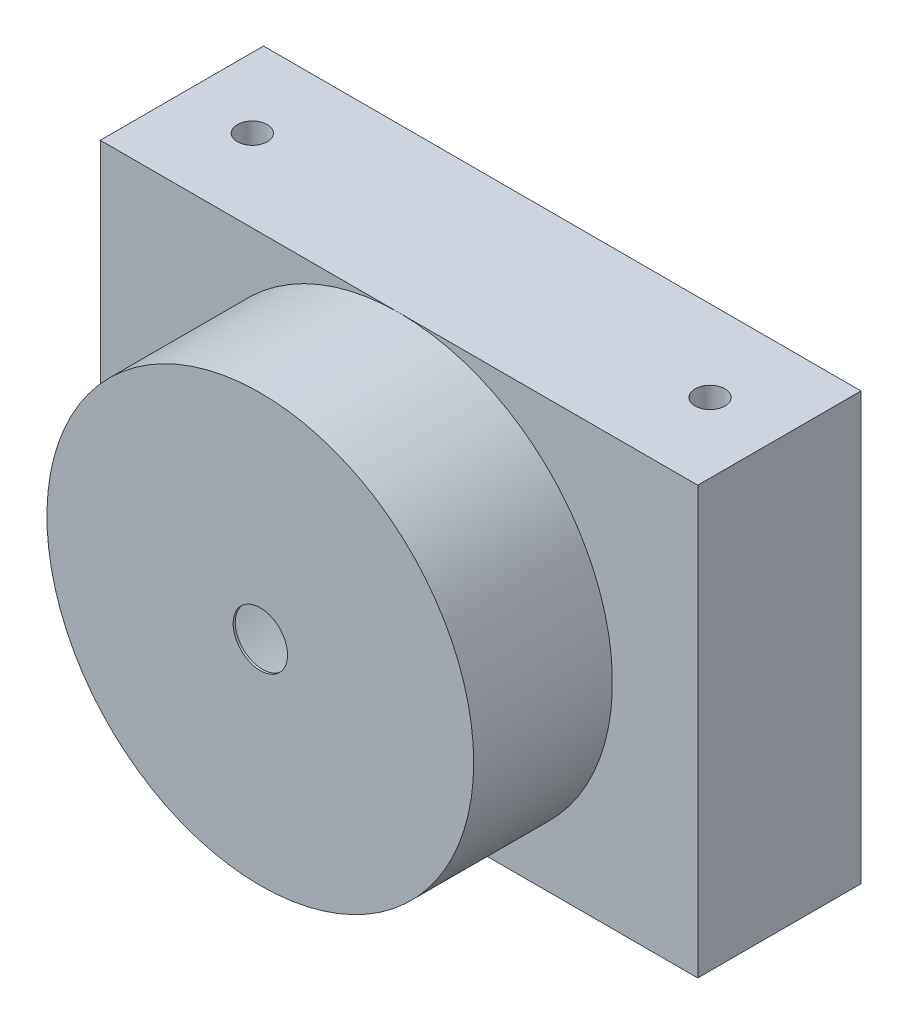
ISO-10303-21;
HEADER;
FILE_DESCRIPTION(('STEP AP214'),'2;1');
FILE_NAME('part.step','',(''),(''),'','','');
FILE_SCHEMA(('AUTOMOTIVE_DESIGN { 1 0 10303 214 1 1 1 1 }'));
ENDSEC;
DATA;
#1=APPLICATION_CONTEXT('core data for automotive mechanical design processes');
#2=APPLICATION_PROTOCOL_DEFINITION('international standard','automotive_design',2000,#1);
#3=PRODUCT_CONTEXT('',#1,'mechanical');
#4=PRODUCT('Part','Part','',(#3));
#5=PRODUCT_RELATED_PRODUCT_CATEGORY('part','',(#4));
#6=PRODUCT_DEFINITION_FORMATION('','',#4);
#7=PRODUCT_DEFINITION_CONTEXT('part definition',#1,'design');
#8=PRODUCT_DEFINITION('design','',#6,#7);
#9=PRODUCT_DEFINITION_SHAPE('','',#8);
#10=(LENGTH_UNIT() NAMED_UNIT(*) SI_UNIT(.MILLI.,.METRE.));
#11=(NAMED_UNIT(*) PLANE_ANGLE_UNIT() SI_UNIT($,.RADIAN.));
#12=(NAMED_UNIT(*) SI_UNIT($,.STERADIAN.) SOLID_ANGLE_UNIT());
#13=UNCERTAINTY_MEASURE_WITH_UNIT(LENGTH_MEASURE(1.E-05),#10,'distance_accuracy_value','');
#14=(GEOMETRIC_REPRESENTATION_CONTEXT(3) GLOBAL_UNCERTAINTY_ASSIGNED_CONTEXT((#13)) GLOBAL_UNIT_ASSIGNED_CONTEXT((#10,
#11,#12)) REPRESENTATION_CONTEXT('',''));
#15=CARTESIAN_POINT('',(0.,0.,0.));
#16=DIRECTION('',(0.,0.,1.));
#17=DIRECTION('',(1.,0.,0.));
#18=AXIS2_PLACEMENT_3D('',#15,#16,#17);
#19=CARTESIAN_POINT('',(0.,0.,15.3));
#20=DIRECTION('',(0.,0.,1.));
#21=DIRECTION('',(1.,0.,0.));
#22=AXIS2_PLACEMENT_3D('',#19,#20,#21);
#23=PLANE('',#22);
#24=CARTESIAN_POINT('',(0.,0.,15.3));
#25=DIRECTION('',(0.,0.,1.));
#26=DIRECTION('',(1.,0.,0.));
#27=AXIS2_PLACEMENT_3D('',#24,#25,#26);
#28=CIRCLE('',#27,20.);
#29=CARTESIAN_POINT('',(0.,20.,15.3));
#30=VERTEX_POINT('',#29);
#31=CARTESIAN_POINT('',(0.,-20.,15.3));
#32=VERTEX_POINT('',#31);
#33=EDGE_CURVE('E44',#30,#32,#28,.T.);
#34=ORIENTED_EDGE('',*,*,#33,.F.);
#35=DIRECTION('',(-1.,0.,0.));
#36=VECTOR('',#35,1.);
#37=CARTESIAN_POINT('',(28.,20.,15.3));
#38=LINE('',#37,#36);
#39=CARTESIAN_POINT('',(-28.,20.,15.3));
#40=VERTEX_POINT('',#39);
#41=EDGE_CURVE('E58',#30,#40,#38,.T.);
#42=ORIENTED_EDGE('',*,*,#41,.T.);
#43=DIRECTION('',(0.,-1.,0.));
#44=VECTOR('',#43,1.);
#45=CARTESIAN_POINT('',(-28.,-20.,15.3));
#46=LINE('',#45,#44);
#47=CARTESIAN_POINT('',(-28.,-20.,15.3));
#48=VERTEX_POINT('',#47);
#49=EDGE_CURVE('E158',#40,#48,#46,.T.);
#50=ORIENTED_EDGE('',*,*,#49,.T.);
#51=DIRECTION('',(1.,0.,0.));
#52=VECTOR('',#51,1.);
#53=CARTESIAN_POINT('',(28.,-20.,15.3));
#54=LINE('',#53,#52);
#55=EDGE_CURVE('E87',#48,#32,#54,.T.);
#56=ORIENTED_EDGE('',*,*,#55,.T.);
#57=EDGE_LOOP('',(#34,#42,#50,#56));
#58=FACE_BOUND('',#57,.T.);
#59=ADVANCED_FACE('F33',(#58),#23,.T.);
#60=CARTESIAN_POINT('',(-28.,-20.,15.3));
#61=DIRECTION('',(1.,0.,0.));
#62=DIRECTION('',(0.,0.,-1.));
#63=AXIS2_PLACEMENT_3D('',#60,#61,#62);
#64=PLANE('',#63);
#65=DIRECTION('',(0.,-1.,0.));
#66=VECTOR('',#65,1.);
#67=CARTESIAN_POINT('',(-28.,-20.,0.));
#68=LINE('',#67,#66);
#69=CARTESIAN_POINT('',(-28.,20.,0.));
#70=VERTEX_POINT('',#69);
#71=CARTESIAN_POINT('',(-28.,-20.,0.));
#72=VERTEX_POINT('',#71);
#73=EDGE_CURVE('E153',#70,#72,#68,.T.);
#74=ORIENTED_EDGE('',*,*,#73,.T.);
#75=DIRECTION('',(0.,0.,-1.));
#76=VECTOR('',#75,1.);
#77=CARTESIAN_POINT('',(-28.,-20.,15.3));
#78=LINE('',#77,#76);
#79=EDGE_CURVE('E42',#48,#72,#78,.T.);
#80=ORIENTED_EDGE('',*,*,#79,.F.);
#81=ORIENTED_EDGE('',*,*,#49,.F.);
#82=DIRECTION('',(0.,0.,-1.));
#83=VECTOR('',#82,1.);
#84=CARTESIAN_POINT('',(-28.,20.,15.3));
#85=LINE('',#84,#83);
#86=EDGE_CURVE('E95',#40,#70,#85,.T.);
#87=ORIENTED_EDGE('',*,*,#86,.T.);
#88=EDGE_LOOP('',(#74,#80,#81,#87));
#89=FACE_BOUND('',#88,.T.);
#90=ADVANCED_FACE('F35',(#89),#64,.F.);
#91=CARTESIAN_POINT('',(28.,-20.,15.3));
#92=DIRECTION('',(0.,1.,0.));
#93=DIRECTION('',(-1.,0.,0.));
#94=AXIS2_PLACEMENT_3D('',#91,#92,#93);
#95=PLANE('',#94);
#96=DIRECTION('',(1.,0.,0.));
#97=VECTOR('',#96,1.);
#98=CARTESIAN_POINT('',(28.,-20.,0.));
#99=LINE('',#98,#97);
#100=CARTESIAN_POINT('',(28.,-20.,0.));
#101=VERTEX_POINT('',#100);
#102=EDGE_CURVE('E144',#72,#101,#99,.T.);
#103=ORIENTED_EDGE('',*,*,#102,.T.);
#104=DIRECTION('',(0.,0.,-1.));
#105=VECTOR('',#104,1.);
#106=CARTESIAN_POINT('',(28.,-20.,15.3));
#107=LINE('',#106,#105);
#108=CARTESIAN_POINT('',(28.,-20.,15.3));
#109=VERTEX_POINT('',#108);
#110=EDGE_CURVE('E146',#109,#101,#107,.T.);
#111=ORIENTED_EDGE('',*,*,#110,.F.);
#112=EDGE_CURVE('E168',#32,#109,#54,.T.);
#113=ORIENTED_EDGE('',*,*,#112,.F.);
#114=ORIENTED_EDGE('',*,*,#55,.F.);
#115=ORIENTED_EDGE('',*,*,#79,.T.);
#116=EDGE_LOOP('',(#103,#111,#113,#114,#115));
#117=FACE_BOUND('',#116,.T.);
#118=ADVANCED_FACE('F124',(#117),#95,.F.);
#119=CARTESIAN_POINT('',(28.,-20.,15.3));
#120=DIRECTION('',(-1.,0.,0.));
#121=DIRECTION('',(0.,0.,1.));
#122=AXIS2_PLACEMENT_3D('',#119,#120,#121);
#123=PLANE('',#122);
#124=DIRECTION('',(0.,1.,0.));
#125=VECTOR('',#124,1.);
#126=CARTESIAN_POINT('',(28.,-20.,0.));
#127=LINE('',#126,#125);
#128=CARTESIAN_POINT('',(28.,20.,0.));
#129=VERTEX_POINT('',#128);
#130=EDGE_CURVE('E152',#101,#129,#127,.T.);
#131=ORIENTED_EDGE('',*,*,#130,.T.);
#132=DIRECTION('',(0.,0.,-1.));
#133=VECTOR('',#132,1.);
#134=CARTESIAN_POINT('',(28.,20.,15.3));
#135=LINE('',#134,#133);
#136=CARTESIAN_POINT('',(28.,20.,15.3));
#137=VERTEX_POINT('',#136);
#138=EDGE_CURVE('E155',#137,#129,#135,.T.);
#139=ORIENTED_EDGE('',*,*,#138,.F.);
#140=DIRECTION('',(0.,1.,0.));
#141=VECTOR('',#140,1.);
#142=CARTESIAN_POINT('',(28.,-20.,15.3));
#143=LINE('',#142,#141);
#144=EDGE_CURVE('E93',#109,#137,#143,.T.);
#145=ORIENTED_EDGE('',*,*,#144,.F.);
#146=ORIENTED_EDGE('',*,*,#110,.T.);
#147=EDGE_LOOP('',(#131,#139,#145,#146));
#148=FACE_BOUND('',#147,.T.);
#149=ADVANCED_FACE('F130',(#148),#123,.F.);
#150=CARTESIAN_POINT('',(28.,20.,15.3));
#151=DIRECTION('',(0.,-1.,0.));
#152=DIRECTION('',(1.,0.,0.));
#153=AXIS2_PLACEMENT_3D('',#150,#151,#152);
#154=PLANE('',#153);
#155=CARTESIAN_POINT('',(21.45,20.,7.6));
#156=DIRECTION('',(0.,1.,0.));
#157=DIRECTION('',(-1.,0.,0.));
#158=AXIS2_PLACEMENT_3D('',#155,#156,#157);
#159=CIRCLE('',#158,1.4);
#160=CARTESIAN_POINT('',(20.05,20.,7.6));
#161=VERTEX_POINT('',#160);
#162=EDGE_CURVE('E176',#161,#161,#159,.T.);
#163=ORIENTED_EDGE('',*,*,#162,.F.);
#164=EDGE_LOOP('',(#163));
#165=FACE_BOUND('',#164,.T.);
#166=CARTESIAN_POINT('',(-21.45,20.,7.6));
#167=DIRECTION('',(0.,1.,0.));
#168=DIRECTION('',(-1.,0.,0.));
#169=AXIS2_PLACEMENT_3D('',#166,#167,#168);
#170=CIRCLE('',#169,1.4);
#171=CARTESIAN_POINT('',(-22.85,20.,7.6));
#172=VERTEX_POINT('',#171);
#173=EDGE_CURVE('E170',#172,#172,#170,.T.);
#174=ORIENTED_EDGE('',*,*,#173,.F.);
#175=EDGE_LOOP('',(#174));
#176=FACE_BOUND('',#175,.T.);
#177=DIRECTION('',(-1.,0.,0.));
#178=VECTOR('',#177,1.);
#179=CARTESIAN_POINT('',(28.,20.,0.));
#180=LINE('',#179,#178);
#181=EDGE_CURVE('E80',#129,#70,#180,.T.);
#182=ORIENTED_EDGE('',*,*,#181,.T.);
#183=ORIENTED_EDGE('',*,*,#86,.F.);
#184=ORIENTED_EDGE('',*,*,#41,.F.);
#185=EDGE_CURVE('E90',#137,#30,#38,.T.);
#186=ORIENTED_EDGE('',*,*,#185,.F.);
#187=ORIENTED_EDGE('',*,*,#138,.T.);
#188=EDGE_LOOP('',(#182,#183,#184,#186,#187));
#189=FACE_BOUND('',#188,.T.);
#190=ADVANCED_FACE('F97',(#165,#176,#189),#154,.F.);
#191=EDGE_CURVE('E11',#32,#30,#28,.T.);
#192=ORIENTED_EDGE('',*,*,#191,.F.);
#193=ORIENTED_EDGE('',*,*,#112,.T.);
#194=ORIENTED_EDGE('',*,*,#144,.T.);
#195=ORIENTED_EDGE('',*,*,#185,.T.);
#196=EDGE_LOOP('',(#192,#193,#194,#195));
#197=FACE_BOUND('',#196,.T.);
#198=ADVANCED_FACE('F91',(#197),#23,.T.);
#199=CARTESIAN_POINT('',(0.,0.,0.));
#200=DIRECTION('',(0.,0.,1.));
#201=DIRECTION('',(1.,0.,0.));
#202=AXIS2_PLACEMENT_3D('',#199,#200,#201);
#203=PLANE('',#202);
#204=CARTESIAN_POINT('',(0.,0.,0.));
#205=DIRECTION('',(0.,0.,-1.));
#206=DIRECTION('',(-1.,0.,0.));
#207=AXIS2_PLACEMENT_3D('',#204,#205,#206);
#208=CIRCLE('',#207,16.);
#209=CARTESIAN_POINT('',(-16.,0.,0.));
#210=VERTEX_POINT('',#209);
#211=EDGE_CURVE('E182',#210,#210,#208,.T.);
#212=ORIENTED_EDGE('',*,*,#211,.F.);
#213=EDGE_LOOP('',(#212));
#214=FACE_BOUND('',#213,.T.);
#215=ORIENTED_EDGE('',*,*,#73,.F.);
#216=ORIENTED_EDGE('',*,*,#181,.F.);
#217=ORIENTED_EDGE('',*,*,#130,.F.);
#218=ORIENTED_EDGE('',*,*,#102,.F.);
#219=EDGE_LOOP('',(#215,#216,#217,#218));
#220=FACE_BOUND('',#219,.T.);
#221=ADVANCED_FACE('F106',(#214,#220),#203,.F.);
#222=CARTESIAN_POINT('',(0.,0.,28.3));
#223=DIRECTION('',(0.,0.,-1.));
#224=DIRECTION('',(-1.,0.,0.));
#225=AXIS2_PLACEMENT_3D('',#222,#223,#224);
#226=CYLINDRICAL_SURFACE('',#225,20.);
#227=CARTESIAN_POINT('',(0.,0.,28.3));
#228=DIRECTION('',(0.,0.,1.));
#229=DIRECTION('',(1.,0.,0.));
#230=AXIS2_PLACEMENT_3D('',#227,#228,#229);
#231=CIRCLE('',#230,20.);
#232=CARTESIAN_POINT('',(20.,0.,28.3));
#233=VERTEX_POINT('',#232);
#234=EDGE_CURVE('E101',#233,#233,#231,.T.);
#235=ORIENTED_EDGE('',*,*,#234,.F.);
#236=EDGE_LOOP('',(#235));
#237=FACE_BOUND('',#236,.T.);
#238=ORIENTED_EDGE('',*,*,#33,.T.);
#239=ORIENTED_EDGE('',*,*,#191,.T.);
#240=EDGE_LOOP('',(#238,#239));
#241=FACE_BOUND('',#240,.T.);
#242=ADVANCED_FACE('F103',(#237,#241),#226,.T.);
#243=CARTESIAN_POINT('',(0.,0.,28.3));
#244=DIRECTION('',(0.,0.,1.));
#245=DIRECTION('',(1.,0.,0.));
#246=AXIS2_PLACEMENT_3D('',#243,#244,#245);
#247=PLANE('',#246);
#248=CARTESIAN_POINT('',(0.,0.,28.3));
#249=DIRECTION('',(0.,0.,1.));
#250=DIRECTION('',(1.,0.,0.));
#251=AXIS2_PLACEMENT_3D('',#248,#249,#250);
#252=CIRCLE('',#251,2.55);
#253=CARTESIAN_POINT('',(2.55,0.,28.3));
#254=VERTEX_POINT('',#253);
#255=EDGE_CURVE('E187',#254,#254,#252,.T.);
#256=ORIENTED_EDGE('',*,*,#255,.F.);
#257=EDGE_LOOP('',(#256));
#258=FACE_BOUND('',#257,.T.);
#259=ORIENTED_EDGE('',*,*,#234,.T.);
#260=EDGE_LOOP('',(#259));
#261=FACE_BOUND('',#260,.T.);
#262=ADVANCED_FACE('F105',(#258,#261),#247,.T.);
#263=CARTESIAN_POINT('',(-21.45,15.,7.6));
#264=DIRECTION('',(0.,1.,0.));
#265=DIRECTION('',(-1.,0.,0.));
#266=AXIS2_PLACEMENT_3D('',#263,#264,#265);
#267=CYLINDRICAL_SURFACE('',#266,1.4);
#268=CARTESIAN_POINT('',(-21.45,15.,7.6));
#269=DIRECTION('',(0.,1.,0.));
#270=DIRECTION('',(-1.,0.,0.));
#271=AXIS2_PLACEMENT_3D('',#268,#269,#270);
#272=CIRCLE('',#271,1.4);
#273=CARTESIAN_POINT('',(-22.85,15.,7.6));
#274=VERTEX_POINT('',#273);
#275=EDGE_CURVE('E102',#274,#274,#272,.T.);
#276=ORIENTED_EDGE('',*,*,#275,.F.);
#277=EDGE_LOOP('',(#276));
#278=FACE_BOUND('',#277,.T.);
#279=ORIENTED_EDGE('',*,*,#173,.T.);
#280=EDGE_LOOP('',(#279));
#281=FACE_BOUND('',#280,.T.);
#282=ADVANCED_FACE('F113',(#278,#281),#267,.F.);
#283=CARTESIAN_POINT('',(-21.45,15.,7.6));
#284=DIRECTION('',(0.,1.,0.));
#285=DIRECTION('',(-1.,0.,0.));
#286=AXIS2_PLACEMENT_3D('',#283,#284,#285);
#287=PLANE('',#286);
#288=ORIENTED_EDGE('',*,*,#275,.T.);
#289=EDGE_LOOP('',(#288));
#290=FACE_BOUND('',#289,.T.);
#291=ADVANCED_FACE('F218',(#290),#287,.T.);
#292=CARTESIAN_POINT('',(21.45,15.,7.6));
#293=DIRECTION('',(0.,1.,0.));
#294=DIRECTION('',(-1.,0.,0.));
#295=AXIS2_PLACEMENT_3D('',#292,#293,#294);
#296=CYLINDRICAL_SURFACE('',#295,1.4);
#297=CARTESIAN_POINT('',(21.45,15.,7.6));
#298=DIRECTION('',(0.,1.,0.));
#299=DIRECTION('',(-1.,0.,0.));
#300=AXIS2_PLACEMENT_3D('',#297,#298,#299);
#301=CIRCLE('',#300,1.4);
#302=CARTESIAN_POINT('',(20.05,15.,7.6));
#303=VERTEX_POINT('',#302);
#304=EDGE_CURVE('E173',#303,#303,#301,.T.);
#305=ORIENTED_EDGE('',*,*,#304,.F.);
#306=EDGE_LOOP('',(#305));
#307=FACE_BOUND('',#306,.T.);
#308=ORIENTED_EDGE('',*,*,#162,.T.);
#309=EDGE_LOOP('',(#308));
#310=FACE_BOUND('',#309,.T.);
#311=ADVANCED_FACE('F211',(#307,#310),#296,.F.);
#312=CARTESIAN_POINT('',(21.45,15.,7.6));
#313=DIRECTION('',(0.,1.,0.));
#314=DIRECTION('',(-1.,0.,0.));
#315=AXIS2_PLACEMENT_3D('',#312,#313,#314);
#316=PLANE('',#315);
#317=ORIENTED_EDGE('',*,*,#304,.T.);
#318=EDGE_LOOP('',(#317));
#319=FACE_BOUND('',#318,.T.);
#320=ADVANCED_FACE('F205',(#319),#316,.T.);
#321=CARTESIAN_POINT('',(0.,0.,28.1));
#322=DIRECTION('',(0.,0.,-1.));
#323=DIRECTION('',(-1.,0.,0.));
#324=AXIS2_PLACEMENT_3D('',#321,#322,#323);
#325=CYLINDRICAL_SURFACE('',#324,16.);
#326=CARTESIAN_POINT('',(0.,0.,28.1));
#327=DIRECTION('',(0.,0.,-1.));
#328=DIRECTION('',(-1.,0.,0.));
#329=AXIS2_PLACEMENT_3D('',#326,#327,#328);
#330=CIRCLE('',#329,16.);
#331=CARTESIAN_POINT('',(-16.,0.,28.1));
#332=VERTEX_POINT('',#331);
#333=EDGE_CURVE('E179',#332,#332,#330,.T.);
#334=ORIENTED_EDGE('',*,*,#333,.F.);
#335=EDGE_LOOP('',(#334));
#336=FACE_BOUND('',#335,.T.);
#337=ORIENTED_EDGE('',*,*,#211,.T.);
#338=EDGE_LOOP('',(#337));
#339=FACE_BOUND('',#338,.T.);
#340=ADVANCED_FACE('F199',(#336,#339),#325,.F.);
#341=CARTESIAN_POINT('',(0.,0.,28.1));
#342=DIRECTION('',(0.,0.,-1.));
#343=DIRECTION('',(-1.,0.,0.));
#344=AXIS2_PLACEMENT_3D('',#341,#342,#343);
#345=PLANE('',#344);
#346=CARTESIAN_POINT('',(0.,0.,28.1));
#347=DIRECTION('',(0.,0.,-1.));
#348=DIRECTION('',(-1.,0.,0.));
#349=AXIS2_PLACEMENT_3D('',#346,#347,#348);
#350=CIRCLE('',#349,2.55);
#351=CARTESIAN_POINT('',(-2.55,0.,28.1));
#352=VERTEX_POINT('',#351);
#353=EDGE_CURVE('E37',#352,#352,#350,.T.);
#354=ORIENTED_EDGE('',*,*,#353,.F.);
#355=EDGE_LOOP('',(#354));
#356=FACE_BOUND('',#355,.T.);
#357=ORIENTED_EDGE('',*,*,#333,.T.);
#358=EDGE_LOOP('',(#357));
#359=FACE_BOUND('',#358,.T.);
#360=ADVANCED_FACE('F196',(#356,#359),#345,.T.);
#361=CARTESIAN_POINT('',(0.,0.,0.299999999999998));
#362=DIRECTION('',(0.,0.,1.));
#363=DIRECTION('',(1.,0.,0.));
#364=AXIS2_PLACEMENT_3D('',#361,#362,#363);
#365=CYLINDRICAL_SURFACE('',#364,2.55);
#366=ORIENTED_EDGE('',*,*,#353,.T.);
#367=EDGE_LOOP('',(#366));
#368=FACE_BOUND('',#367,.T.);
#369=ORIENTED_EDGE('',*,*,#255,.T.);
#370=EDGE_LOOP('',(#369));
#371=FACE_BOUND('',#370,.T.);
#372=ADVANCED_FACE('F194',(#368,#371),#365,.F.);
#373=CLOSED_SHELL('',(#59,#90,#118,#149,#190,#198,#221,#242,#262,#282,#291,#311,#320,#340,#360,#372));
#374=MANIFOLD_SOLID_BREP('B2',#373);
#375=ADVANCED_BREP_SHAPE_REPRESENTATION('',(#18,#374),#14);
#376=SHAPE_DEFINITION_REPRESENTATION(#9,#375);
ENDSEC;
END-ISO-10303-21;
